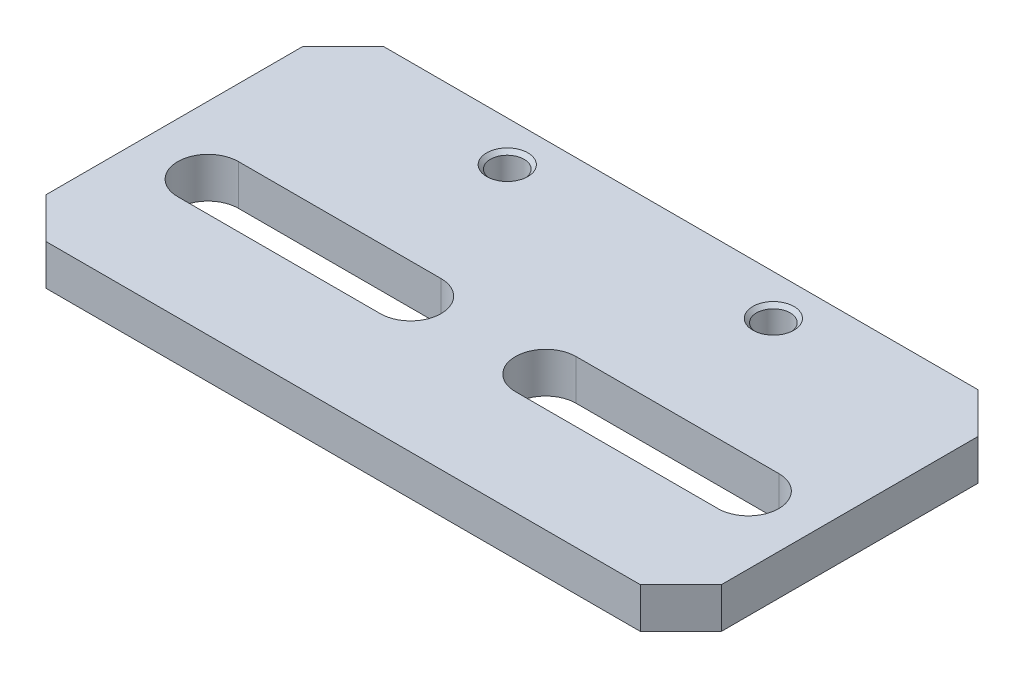
ISO-10303-21;
HEADER;
FILE_DESCRIPTION(('STEP AP214'),'2;1');
FILE_NAME('part.step','',(''),(''),'','','');
FILE_SCHEMA(('AUTOMOTIVE_DESIGN { 1 0 10303 214 1 1 1 1 }'));
ENDSEC;
DATA;
#1=APPLICATION_CONTEXT('core data for automotive mechanical design processes');
#2=APPLICATION_PROTOCOL_DEFINITION('international standard','automotive_design',2000,#1);
#3=PRODUCT_CONTEXT('',#1,'mechanical');
#4=PRODUCT('Part','Part','',(#3));
#5=PRODUCT_RELATED_PRODUCT_CATEGORY('part','',(#4));
#6=PRODUCT_DEFINITION_FORMATION('','',#4);
#7=PRODUCT_DEFINITION_CONTEXT('part definition',#1,'design');
#8=PRODUCT_DEFINITION('design','',#6,#7);
#9=PRODUCT_DEFINITION_SHAPE('','',#8);
#10=(LENGTH_UNIT() NAMED_UNIT(*) SI_UNIT(.MILLI.,.METRE.));
#11=(NAMED_UNIT(*) PLANE_ANGLE_UNIT() SI_UNIT($,.RADIAN.));
#12=(NAMED_UNIT(*) SI_UNIT($,.STERADIAN.) SOLID_ANGLE_UNIT());
#13=UNCERTAINTY_MEASURE_WITH_UNIT(LENGTH_MEASURE(1.E-05),#10,'distance_accuracy_value','');
#14=(GEOMETRIC_REPRESENTATION_CONTEXT(3) GLOBAL_UNCERTAINTY_ASSIGNED_CONTEXT((#13)) GLOBAL_UNIT_ASSIGNED_CONTEXT((#10,
#11,#12)) REPRESENTATION_CONTEXT('',''));
#15=CARTESIAN_POINT('',(0.,0.,0.));
#16=DIRECTION('',(0.,0.,1.));
#17=DIRECTION('',(1.,0.,0.));
#18=AXIS2_PLACEMENT_3D('',#15,#16,#17);
#19=CARTESIAN_POINT('',(22.,3.,-12.5));
#20=DIRECTION('',(-0.707106781186548,0.,0.707106781186547));
#21=DIRECTION('',(0.,1.,0.));
#22=AXIS2_PLACEMENT_3D('',#19,#20,#21);
#23=PLANE('',#22);
#24=DIRECTION('',(-0.707106781186547,0.,-0.707106781186548));
#25=VECTOR('',#24,1.);
#26=CARTESIAN_POINT('',(17.25,3.,-17.25));
#27=LINE('',#26,#25);
#28=CARTESIAN_POINT('',(25.,3.,-9.5));
#29=VERTEX_POINT('',#28);
#30=CARTESIAN_POINT('',(22.,3.,-12.5));
#31=VERTEX_POINT('',#30);
#32=EDGE_CURVE('E200',#29,#31,#27,.T.);
#33=ORIENTED_EDGE('',*,*,#32,.F.);
#34=DIRECTION('',(0.,1.,0.));
#35=VECTOR('',#34,1.);
#36=CARTESIAN_POINT('',(25.,3.,-9.5));
#37=LINE('',#36,#35);
#38=CARTESIAN_POINT('',(25.,0.,-9.5));
#39=VERTEX_POINT('',#38);
#40=EDGE_CURVE('E202',#39,#29,#37,.T.);
#41=ORIENTED_EDGE('',*,*,#40,.F.);
#42=DIRECTION('',(0.707106781186547,0.,0.707106781186548));
#43=VECTOR('',#42,1.);
#44=CARTESIAN_POINT('',(22.,0.,-12.5));
#45=LINE('',#44,#43);
#46=CARTESIAN_POINT('',(22.,0.,-12.5));
#47=VERTEX_POINT('',#46);
#48=EDGE_CURVE('E242',#47,#39,#45,.T.);
#49=ORIENTED_EDGE('',*,*,#48,.F.);
#50=DIRECTION('',(0.,-1.,0.));
#51=VECTOR('',#50,1.);
#52=CARTESIAN_POINT('',(22.,3.,-12.5));
#53=LINE('',#52,#51);
#54=EDGE_CURVE('E205',#31,#47,#53,.T.);
#55=ORIENTED_EDGE('',*,*,#54,.F.);
#56=EDGE_LOOP('',(#33,#41,#49,#55));
#57=FACE_BOUND('',#56,.T.);
#58=ADVANCED_FACE('F17',(#57),#23,.F.);
#59=CARTESIAN_POINT('',(-25.,3.,-9.5));
#60=DIRECTION('',(0.707106781186547,0.,0.707106781186548));
#61=DIRECTION('',(0.,-1.,0.));
#62=AXIS2_PLACEMENT_3D('',#59,#60,#61);
#63=PLANE('',#62);
#64=DIRECTION('',(-0.707106781186548,0.,0.707106781186547));
#65=VECTOR('',#64,1.);
#66=CARTESIAN_POINT('',(-17.25,3.,-17.25));
#67=LINE('',#66,#65);
#68=CARTESIAN_POINT('',(-22.,3.,-12.5));
#69=VERTEX_POINT('',#68);
#70=CARTESIAN_POINT('',(-25.,3.,-9.5));
#71=VERTEX_POINT('',#70);
#72=EDGE_CURVE('E211',#69,#71,#67,.T.);
#73=ORIENTED_EDGE('',*,*,#72,.F.);
#74=DIRECTION('',(0.,1.,0.));
#75=VECTOR('',#74,1.);
#76=CARTESIAN_POINT('',(-22.,3.,-12.5));
#77=LINE('',#76,#75);
#78=CARTESIAN_POINT('',(-22.,0.,-12.5));
#79=VERTEX_POINT('',#78);
#80=EDGE_CURVE('E256',#79,#69,#77,.T.);
#81=ORIENTED_EDGE('',*,*,#80,.F.);
#82=DIRECTION('',(0.707106781186548,0.,-0.707106781186547));
#83=VECTOR('',#82,1.);
#84=CARTESIAN_POINT('',(-25.,0.,-9.5));
#85=LINE('',#84,#83);
#86=CARTESIAN_POINT('',(-25.,0.,-9.5));
#87=VERTEX_POINT('',#86);
#88=EDGE_CURVE('E246',#87,#79,#85,.T.);
#89=ORIENTED_EDGE('',*,*,#88,.F.);
#90=DIRECTION('',(0.,-1.,0.));
#91=VECTOR('',#90,1.);
#92=CARTESIAN_POINT('',(-25.,3.,-9.5));
#93=LINE('',#92,#91);
#94=EDGE_CURVE('E406',#71,#87,#93,.T.);
#95=ORIENTED_EDGE('',*,*,#94,.F.);
#96=EDGE_LOOP('',(#73,#81,#89,#95));
#97=FACE_BOUND('',#96,.T.);
#98=ADVANCED_FACE('F795',(#97),#63,.F.);
#99=CARTESIAN_POINT('',(-22.,3.,12.5));
#100=DIRECTION('',(0.707106781186548,0.,-0.707106781186547));
#101=DIRECTION('',(0.,-1.,0.));
#102=AXIS2_PLACEMENT_3D('',#99,#100,#101);
#103=PLANE('',#102);
#104=DIRECTION('',(0.707106781186547,0.,0.707106781186548));
#105=VECTOR('',#104,1.);
#106=CARTESIAN_POINT('',(-17.25,3.,17.25));
#107=LINE('',#106,#105);
#108=CARTESIAN_POINT('',(-25.,3.,9.5));
#109=VERTEX_POINT('',#108);
#110=CARTESIAN_POINT('',(-22.,3.,12.5));
#111=VERTEX_POINT('',#110);
#112=EDGE_CURVE('E268',#109,#111,#107,.T.);
#113=ORIENTED_EDGE('',*,*,#112,.F.);
#114=DIRECTION('',(0.,1.,0.));
#115=VECTOR('',#114,1.);
#116=CARTESIAN_POINT('',(-25.,3.,9.5));
#117=LINE('',#116,#115);
#118=CARTESIAN_POINT('',(-25.,0.,9.5));
#119=VERTEX_POINT('',#118);
#120=EDGE_CURVE('E433',#119,#109,#117,.T.);
#121=ORIENTED_EDGE('',*,*,#120,.F.);
#122=DIRECTION('',(-0.707106781186547,0.,-0.707106781186548));
#123=VECTOR('',#122,1.);
#124=CARTESIAN_POINT('',(-22.,0.,12.5));
#125=LINE('',#124,#123);
#126=CARTESIAN_POINT('',(-22.,0.,12.5));
#127=VERTEX_POINT('',#126);
#128=EDGE_CURVE('E257',#127,#119,#125,.T.);
#129=ORIENTED_EDGE('',*,*,#128,.F.);
#130=DIRECTION('',(0.,-1.,0.));
#131=VECTOR('',#130,1.);
#132=CARTESIAN_POINT('',(-22.,3.,12.5));
#133=LINE('',#132,#131);
#134=EDGE_CURVE('E229',#111,#127,#133,.T.);
#135=ORIENTED_EDGE('',*,*,#134,.F.);
#136=EDGE_LOOP('',(#113,#121,#129,#135));
#137=FACE_BOUND('',#136,.T.);
#138=ADVANCED_FACE('F432',(#137),#103,.F.);
#139=CARTESIAN_POINT('',(25.,3.,9.5));
#140=DIRECTION('',(-0.707106781186547,0.,-0.707106781186548));
#141=DIRECTION('',(-0.707106781186548,0.,0.707106781186547));
#142=AXIS2_PLACEMENT_3D('',#139,#140,#141);
#143=PLANE('',#142);
#144=DIRECTION('',(0.707106781186548,0.,-0.707106781186547));
#145=VECTOR('',#144,1.);
#146=CARTESIAN_POINT('',(17.25,3.,17.25));
#147=LINE('',#146,#145);
#148=CARTESIAN_POINT('',(22.,3.,12.5));
#149=VERTEX_POINT('',#148);
#150=CARTESIAN_POINT('',(25.,3.,9.5));
#151=VERTEX_POINT('',#150);
#152=EDGE_CURVE('E212',#149,#151,#147,.T.);
#153=ORIENTED_EDGE('',*,*,#152,.F.);
#154=DIRECTION('',(0.,1.,0.));
#155=VECTOR('',#154,1.);
#156=CARTESIAN_POINT('',(22.,3.,12.5));
#157=LINE('',#156,#155);
#158=CARTESIAN_POINT('',(22.,0.,12.5));
#159=VERTEX_POINT('',#158);
#160=EDGE_CURVE('E396',#159,#149,#157,.T.);
#161=ORIENTED_EDGE('',*,*,#160,.F.);
#162=DIRECTION('',(-0.707106781186548,0.,0.707106781186547));
#163=VECTOR('',#162,1.);
#164=CARTESIAN_POINT('',(25.,0.,9.5));
#165=LINE('',#164,#163);
#166=CARTESIAN_POINT('',(25.,0.,9.5));
#167=VERTEX_POINT('',#166);
#168=EDGE_CURVE('E259',#167,#159,#165,.T.);
#169=ORIENTED_EDGE('',*,*,#168,.F.);
#170=DIRECTION('',(0.,-1.,0.));
#171=VECTOR('',#170,1.);
#172=CARTESIAN_POINT('',(25.,3.,9.5));
#173=LINE('',#172,#171);
#174=EDGE_CURVE('E228',#151,#167,#173,.T.);
#175=ORIENTED_EDGE('',*,*,#174,.F.);
#176=EDGE_LOOP('',(#153,#161,#169,#175));
#177=FACE_BOUND('',#176,.T.);
#178=ADVANCED_FACE('F394',(#177),#143,.F.);
#179=CARTESIAN_POINT('',(-20.,0.,4.75));
#180=DIRECTION('',(0.,0.,1.));
#181=DIRECTION('',(1.,0.,0.));
#182=AXIS2_PLACEMENT_3D('',#179,#180,#181);
#183=PLANE('',#182);
#184=DIRECTION('',(1.,0.,0.));
#185=VECTOR('',#184,1.);
#186=CARTESIAN_POINT('',(-20.,3.,4.75));
#187=LINE('',#186,#185);
#188=CARTESIAN_POINT('',(-20.,3.,4.75));
#189=VERTEX_POINT('',#188);
#190=CARTESIAN_POINT('',(-5.,3.,4.75));
#191=VERTEX_POINT('',#190);
#192=EDGE_CURVE('E247',#189,#191,#187,.T.);
#193=ORIENTED_EDGE('',*,*,#192,.T.);
#194=DIRECTION('',(0.,1.,0.));
#195=VECTOR('',#194,1.);
#196=CARTESIAN_POINT('',(-5.,0.,4.75));
#197=LINE('',#196,#195);
#198=CARTESIAN_POINT('',(-5.,0.,4.75));
#199=VERTEX_POINT('',#198);
#200=EDGE_CURVE('E11',#199,#191,#197,.T.);
#201=ORIENTED_EDGE('',*,*,#200,.F.);
#202=DIRECTION('',(1.,0.,0.));
#203=VECTOR('',#202,1.);
#204=CARTESIAN_POINT('',(-20.,0.,4.75));
#205=LINE('',#204,#203);
#206=CARTESIAN_POINT('',(-20.,0.,4.75));
#207=VERTEX_POINT('',#206);
#208=EDGE_CURVE('E321',#207,#199,#205,.T.);
#209=ORIENTED_EDGE('',*,*,#208,.F.);
#210=DIRECTION('',(0.,1.,0.));
#211=VECTOR('',#210,1.);
#212=CARTESIAN_POINT('',(-20.,0.,4.75));
#213=LINE('',#212,#211);
#214=EDGE_CURVE('E355',#207,#189,#213,.T.);
#215=ORIENTED_EDGE('',*,*,#214,.T.);
#216=EDGE_LOOP('',(#193,#201,#209,#215));
#217=FACE_BOUND('',#216,.T.);
#218=ADVANCED_FACE('F380',(#217),#183,.F.);
#219=CARTESIAN_POINT('',(-5.,0.,2.5));
#220=DIRECTION('',(0.,1.,0.));
#221=DIRECTION('',(0.,0.,1.));
#222=AXIS2_PLACEMENT_3D('',#219,#220,#221);
#223=CYLINDRICAL_SURFACE('',#222,2.25);
#224=CARTESIAN_POINT('',(-5.,3.,2.5));
#225=DIRECTION('',(0.,1.,0.));
#226=DIRECTION('',(0.,0.,1.));
#227=AXIS2_PLACEMENT_3D('',#224,#225,#226);
#228=CIRCLE('',#227,2.25);
#229=CARTESIAN_POINT('',(-5.,3.,0.25));
#230=VERTEX_POINT('',#229);
#231=EDGE_CURVE('E252',#191,#230,#228,.T.);
#232=ORIENTED_EDGE('',*,*,#231,.T.);
#233=DIRECTION('',(0.,1.,0.));
#234=VECTOR('',#233,1.);
#235=CARTESIAN_POINT('',(-5.,0.,0.25));
#236=LINE('',#235,#234);
#237=CARTESIAN_POINT('',(-5.,0.,0.25));
#238=VERTEX_POINT('',#237);
#239=EDGE_CURVE('E25',#238,#230,#236,.T.);
#240=ORIENTED_EDGE('',*,*,#239,.F.);
#241=CARTESIAN_POINT('',(-5.,0.,2.5));
#242=DIRECTION('',(0.,1.,0.));
#243=DIRECTION('',(0.,0.,1.));
#244=AXIS2_PLACEMENT_3D('',#241,#242,#243);
#245=CIRCLE('',#244,2.25);
#246=EDGE_CURVE('E325',#199,#238,#245,.T.);
#247=ORIENTED_EDGE('',*,*,#246,.F.);
#248=ORIENTED_EDGE('',*,*,#200,.T.);
#249=EDGE_LOOP('',(#232,#240,#247,#248));
#250=FACE_BOUND('',#249,.T.);
#251=ADVANCED_FACE('F374',(#250),#223,.F.);
#252=CARTESIAN_POINT('',(-20.,0.,0.250000000000007));
#253=DIRECTION('',(0.,0.,-1.));
#254=DIRECTION('',(-1.,0.,0.));
#255=AXIS2_PLACEMENT_3D('',#252,#253,#254);
#256=PLANE('',#255);
#257=DIRECTION('',(-1.,0.,0.));
#258=VECTOR('',#257,1.);
#259=CARTESIAN_POINT('',(-20.,3.,0.250000000000007));
#260=LINE('',#259,#258);
#261=CARTESIAN_POINT('',(-20.,3.,0.250000000000007));
#262=VERTEX_POINT('',#261);
#263=EDGE_CURVE('E278',#230,#262,#260,.T.);
#264=ORIENTED_EDGE('',*,*,#263,.T.);
#265=DIRECTION('',(0.,1.,0.));
#266=VECTOR('',#265,1.);
#267=CARTESIAN_POINT('',(-20.,0.,0.250000000000007));
#268=LINE('',#267,#266);
#269=CARTESIAN_POINT('',(-20.,0.,0.250000000000007));
#270=VERTEX_POINT('',#269);
#271=EDGE_CURVE('E357',#270,#262,#268,.T.);
#272=ORIENTED_EDGE('',*,*,#271,.F.);
#273=DIRECTION('',(-1.,0.,0.));
#274=VECTOR('',#273,1.);
#275=CARTESIAN_POINT('',(-20.,0.,0.250000000000007));
#276=LINE('',#275,#274);
#277=EDGE_CURVE('E245',#238,#270,#276,.T.);
#278=ORIENTED_EDGE('',*,*,#277,.F.);
#279=ORIENTED_EDGE('',*,*,#239,.T.);
#280=EDGE_LOOP('',(#264,#272,#278,#279));
#281=FACE_BOUND('',#280,.T.);
#282=ADVANCED_FACE('F368',(#281),#256,.F.);
#283=CARTESIAN_POINT('',(-20.,0.,2.5));
#284=DIRECTION('',(0.,1.,0.));
#285=DIRECTION('',(0.,0.,1.));
#286=AXIS2_PLACEMENT_3D('',#283,#284,#285);
#287=CYLINDRICAL_SURFACE('',#286,2.25);
#288=CARTESIAN_POINT('',(-20.,3.,2.5));
#289=DIRECTION('',(0.,1.,0.));
#290=DIRECTION('',(0.,0.,1.));
#291=AXIS2_PLACEMENT_3D('',#288,#289,#290);
#292=CIRCLE('',#291,2.25);
#293=EDGE_CURVE('E271',#262,#189,#292,.T.);
#294=ORIENTED_EDGE('',*,*,#293,.T.);
#295=ORIENTED_EDGE('',*,*,#214,.F.);
#296=CARTESIAN_POINT('',(-20.,0.,2.5));
#297=DIRECTION('',(0.,1.,0.));
#298=DIRECTION('',(0.,0.,1.));
#299=AXIS2_PLACEMENT_3D('',#296,#297,#298);
#300=CIRCLE('',#299,2.25);
#301=EDGE_CURVE('E317',#270,#207,#300,.T.);
#302=ORIENTED_EDGE('',*,*,#301,.F.);
#303=ORIENTED_EDGE('',*,*,#271,.T.);
#304=EDGE_LOOP('',(#294,#295,#302,#303));
#305=FACE_BOUND('',#304,.T.);
#306=ADVANCED_FACE('F377',(#305),#287,.F.);
#307=CARTESIAN_POINT('',(20.,0.,0.249999999999994));
#308=DIRECTION('',(0.,0.,-1.));
#309=DIRECTION('',(-1.,0.,0.));
#310=AXIS2_PLACEMENT_3D('',#307,#308,#309);
#311=PLANE('',#310);
#312=DIRECTION('',(-1.,0.,0.));
#313=VECTOR('',#312,1.);
#314=CARTESIAN_POINT('',(20.,3.,0.249999999999994));
#315=LINE('',#314,#313);
#316=CARTESIAN_POINT('',(20.,3.,0.249999999999994));
#317=VERTEX_POINT('',#316);
#318=CARTESIAN_POINT('',(5.,3.,0.25));
#319=VERTEX_POINT('',#318);
#320=EDGE_CURVE('E286',#317,#319,#315,.T.);
#321=ORIENTED_EDGE('',*,*,#320,.T.);
#322=DIRECTION('',(0.,1.,0.));
#323=VECTOR('',#322,1.);
#324=CARTESIAN_POINT('',(5.,0.,0.25));
#325=LINE('',#324,#323);
#326=CARTESIAN_POINT('',(5.,0.,0.25));
#327=VERTEX_POINT('',#326);
#328=EDGE_CURVE('E264',#327,#319,#325,.T.);
#329=ORIENTED_EDGE('',*,*,#328,.F.);
#330=DIRECTION('',(-1.,0.,0.));
#331=VECTOR('',#330,1.);
#332=CARTESIAN_POINT('',(20.,0.,0.249999999999994));
#333=LINE('',#332,#331);
#334=CARTESIAN_POINT('',(20.,0.,0.249999999999994));
#335=VERTEX_POINT('',#334);
#336=EDGE_CURVE('E312',#335,#327,#333,.T.);
#337=ORIENTED_EDGE('',*,*,#336,.F.);
#338=DIRECTION('',(0.,1.,0.));
#339=VECTOR('',#338,1.);
#340=CARTESIAN_POINT('',(20.,0.,0.249999999999994));
#341=LINE('',#340,#339);
#342=EDGE_CURVE('E274',#335,#317,#341,.T.);
#343=ORIENTED_EDGE('',*,*,#342,.T.);
#344=EDGE_LOOP('',(#321,#329,#337,#343));
#345=FACE_BOUND('',#344,.T.);
#346=ADVANCED_FACE('F704',(#345),#311,.F.);
#347=CARTESIAN_POINT('',(5.,0.,2.5));
#348=DIRECTION('',(0.,1.,0.));
#349=DIRECTION('',(0.,0.,1.));
#350=AXIS2_PLACEMENT_3D('',#347,#348,#349);
#351=CYLINDRICAL_SURFACE('',#350,2.25);
#352=CARTESIAN_POINT('',(5.,3.,2.5));
#353=DIRECTION('',(0.,1.,0.));
#354=DIRECTION('',(0.,0.,1.));
#355=AXIS2_PLACEMENT_3D('',#352,#353,#354);
#356=CIRCLE('',#355,2.25);
#357=CARTESIAN_POINT('',(5.,3.,4.75));
#358=VERTEX_POINT('',#357);
#359=EDGE_CURVE('E290',#319,#358,#356,.T.);
#360=ORIENTED_EDGE('',*,*,#359,.T.);
#361=DIRECTION('',(0.,1.,0.));
#362=VECTOR('',#361,1.);
#363=CARTESIAN_POINT('',(5.,0.,4.75));
#364=LINE('',#363,#362);
#365=CARTESIAN_POINT('',(5.,0.,4.75));
#366=VERTEX_POINT('',#365);
#367=EDGE_CURVE('E261',#366,#358,#364,.T.);
#368=ORIENTED_EDGE('',*,*,#367,.F.);
#369=CARTESIAN_POINT('',(5.,0.,2.5));
#370=DIRECTION('',(0.,1.,0.));
#371=DIRECTION('',(0.,0.,1.));
#372=AXIS2_PLACEMENT_3D('',#369,#370,#371);
#373=CIRCLE('',#372,2.25);
#374=EDGE_CURVE('E335',#327,#366,#373,.T.);
#375=ORIENTED_EDGE('',*,*,#374,.F.);
#376=ORIENTED_EDGE('',*,*,#328,.T.);
#377=EDGE_LOOP('',(#360,#368,#375,#376));
#378=FACE_BOUND('',#377,.T.);
#379=ADVANCED_FACE('F699',(#378),#351,.F.);
#380=CARTESIAN_POINT('',(20.,0.,4.75));
#381=DIRECTION('',(0.,0.,1.));
#382=DIRECTION('',(1.,0.,0.));
#383=AXIS2_PLACEMENT_3D('',#380,#381,#382);
#384=PLANE('',#383);
#385=DIRECTION('',(1.,0.,0.));
#386=VECTOR('',#385,1.);
#387=CARTESIAN_POINT('',(20.,3.,4.75));
#388=LINE('',#387,#386);
#389=CARTESIAN_POINT('',(20.,3.,4.75));
#390=VERTEX_POINT('',#389);
#391=EDGE_CURVE('E299',#358,#390,#388,.T.);
#392=ORIENTED_EDGE('',*,*,#391,.T.);
#393=DIRECTION('',(0.,1.,0.));
#394=VECTOR('',#393,1.);
#395=CARTESIAN_POINT('',(20.,0.,4.75));
#396=LINE('',#395,#394);
#397=CARTESIAN_POINT('',(20.,0.,4.75));
#398=VERTEX_POINT('',#397);
#399=EDGE_CURVE('E265',#398,#390,#396,.T.);
#400=ORIENTED_EDGE('',*,*,#399,.F.);
#401=DIRECTION('',(1.,0.,0.));
#402=VECTOR('',#401,1.);
#403=CARTESIAN_POINT('',(20.,0.,4.75));
#404=LINE('',#403,#402);
#405=EDGE_CURVE('E313',#366,#398,#404,.T.);
#406=ORIENTED_EDGE('',*,*,#405,.F.);
#407=ORIENTED_EDGE('',*,*,#367,.T.);
#408=EDGE_LOOP('',(#392,#400,#406,#407));
#409=FACE_BOUND('',#408,.T.);
#410=ADVANCED_FACE('F703',(#409),#384,.F.);
#411=CARTESIAN_POINT('',(20.,0.,2.5));
#412=DIRECTION('',(0.,1.,0.));
#413=DIRECTION('',(0.,0.,1.));
#414=AXIS2_PLACEMENT_3D('',#411,#412,#413);
#415=CYLINDRICAL_SURFACE('',#414,2.25);
#416=CARTESIAN_POINT('',(20.,3.,2.5));
#417=DIRECTION('',(0.,1.,0.));
#418=DIRECTION('',(0.,0.,1.));
#419=AXIS2_PLACEMENT_3D('',#416,#417,#418);
#420=CIRCLE('',#419,2.25);
#421=EDGE_CURVE('E251',#390,#317,#420,.T.);
#422=ORIENTED_EDGE('',*,*,#421,.T.);
#423=ORIENTED_EDGE('',*,*,#342,.F.);
#424=CARTESIAN_POINT('',(20.,0.,2.5));
#425=DIRECTION('',(0.,1.,0.));
#426=DIRECTION('',(0.,0.,1.));
#427=AXIS2_PLACEMENT_3D('',#424,#425,#426);
#428=CIRCLE('',#427,2.25);
#429=EDGE_CURVE('E308',#398,#335,#428,.T.);
#430=ORIENTED_EDGE('',*,*,#429,.F.);
#431=ORIENTED_EDGE('',*,*,#399,.T.);
#432=EDGE_LOOP('',(#422,#423,#430,#431));
#433=FACE_BOUND('',#432,.T.);
#434=ADVANCED_FACE('F786',(#433),#415,.F.);
#435=CARTESIAN_POINT('',(-9.85,3.,-9.5));
#436=DIRECTION('',(0.,1.,0.));
#437=DIRECTION('',(0.,0.,1.));
#438=AXIS2_PLACEMENT_3D('',#435,#436,#437);
#439=CONICAL_SURFACE('',#438,1.525,0.785398163397448);
#440=CARTESIAN_POINT('',(-9.85,2.725,-9.5));
#441=DIRECTION('',(0.,1.,0.));
#442=DIRECTION('',(0.,0.,1.));
#443=AXIS2_PLACEMENT_3D('',#440,#441,#442);
#444=CIRCLE('',#443,1.25);
#445=CARTESIAN_POINT('',(-9.85,2.725,-8.25));
#446=VERTEX_POINT('',#445);
#447=EDGE_CURVE('E36',#446,#446,#444,.T.);
#448=ORIENTED_EDGE('',*,*,#447,.F.);
#449=EDGE_LOOP('',(#448));
#450=FACE_BOUND('',#449,.T.);
#451=CARTESIAN_POINT('',(-9.85,3.,-9.5));
#452=DIRECTION('',(0.,1.,0.));
#453=DIRECTION('',(0.,0.,1.));
#454=AXIS2_PLACEMENT_3D('',#451,#452,#453);
#455=CIRCLE('',#454,1.525);
#456=CARTESIAN_POINT('',(-9.85,3.,-7.975));
#457=VERTEX_POINT('',#456);
#458=EDGE_CURVE('E282',#457,#457,#455,.T.);
#459=ORIENTED_EDGE('',*,*,#458,.T.);
#460=EDGE_LOOP('',(#459));
#461=FACE_BOUND('',#460,.T.);
#462=ADVANCED_FACE('F731',(#450,#461),#439,.F.);
#463=CARTESIAN_POINT('',(-9.85,3.,-9.5));
#464=DIRECTION('',(0.,1.,0.));
#465=DIRECTION('',(0.,0.,1.));
#466=AXIS2_PLACEMENT_3D('',#463,#464,#465);
#467=CYLINDRICAL_SURFACE('',#466,1.25);
#468=CARTESIAN_POINT('',(-9.85,0.275,-9.5));
#469=DIRECTION('',(0.,1.,0.));
#470=DIRECTION('',(0.,0.,1.));
#471=AXIS2_PLACEMENT_3D('',#468,#469,#470);
#472=CIRCLE('',#471,1.25);
#473=CARTESIAN_POINT('',(-9.85,0.275,-8.25));
#474=VERTEX_POINT('',#473);
#475=EDGE_CURVE('E44',#474,#474,#472,.T.);
#476=ORIENTED_EDGE('',*,*,#475,.F.);
#477=EDGE_LOOP('',(#476));
#478=FACE_BOUND('',#477,.T.);
#479=ORIENTED_EDGE('',*,*,#447,.T.);
#480=EDGE_LOOP('',(#479));
#481=FACE_BOUND('',#480,.T.);
#482=ADVANCED_FACE('F726',(#478,#481),#467,.F.);
#483=CARTESIAN_POINT('',(-9.85,0.275,-9.5));
#484=DIRECTION('',(0.,-1.,0.));
#485=DIRECTION('',(0.,0.,-1.));
#486=AXIS2_PLACEMENT_3D('',#483,#484,#485);
#487=CONICAL_SURFACE('',#486,1.25,0.785398163397447);
#488=ORIENTED_EDGE('',*,*,#475,.T.);
#489=EDGE_LOOP('',(#488));
#490=FACE_BOUND('',#489,.T.);
#491=CARTESIAN_POINT('',(-9.85,0.,-9.5));
#492=DIRECTION('',(0.,1.,0.));
#493=DIRECTION('',(0.,0.,1.));
#494=AXIS2_PLACEMENT_3D('',#491,#492,#493);
#495=CIRCLE('',#494,1.525);
#496=CARTESIAN_POINT('',(-9.85,0.,-7.975));
#497=VERTEX_POINT('',#496);
#498=EDGE_CURVE('E339',#497,#497,#495,.T.);
#499=ORIENTED_EDGE('',*,*,#498,.F.);
#500=EDGE_LOOP('',(#499));
#501=FACE_BOUND('',#500,.T.);
#502=ADVANCED_FACE('F730',(#490,#501),#487,.F.);
#503=CARTESIAN_POINT('',(9.85,3.,-9.5));
#504=DIRECTION('',(0.,1.,0.));
#505=DIRECTION('',(0.,0.,1.));
#506=AXIS2_PLACEMENT_3D('',#503,#504,#505);
#507=CONICAL_SURFACE('',#506,1.525,0.785398163397448);
#508=CARTESIAN_POINT('',(9.85,2.725,-9.5));
#509=DIRECTION('',(0.,1.,0.));
#510=DIRECTION('',(0.,0.,1.));
#511=AXIS2_PLACEMENT_3D('',#508,#509,#510);
#512=CIRCLE('',#511,1.25);
#513=CARTESIAN_POINT('',(9.85,2.725,-8.25));
#514=VERTEX_POINT('',#513);
#515=EDGE_CURVE('E346',#514,#514,#512,.T.);
#516=ORIENTED_EDGE('',*,*,#515,.F.);
#517=EDGE_LOOP('',(#516));
#518=FACE_BOUND('',#517,.T.);
#519=CARTESIAN_POINT('',(9.85,3.,-9.5));
#520=DIRECTION('',(0.,1.,0.));
#521=DIRECTION('',(0.,0.,1.));
#522=AXIS2_PLACEMENT_3D('',#519,#520,#521);
#523=CIRCLE('',#522,1.525);
#524=CARTESIAN_POINT('',(9.85,3.,-7.975));
#525=VERTEX_POINT('',#524);
#526=EDGE_CURVE('E279',#525,#525,#523,.T.);
#527=ORIENTED_EDGE('',*,*,#526,.T.);
#528=EDGE_LOOP('',(#527));
#529=FACE_BOUND('',#528,.T.);
#530=ADVANCED_FACE('F762',(#518,#529),#507,.F.);
#531=CARTESIAN_POINT('',(9.85,3.,-9.5));
#532=DIRECTION('',(0.,1.,0.));
#533=DIRECTION('',(0.,0.,1.));
#534=AXIS2_PLACEMENT_3D('',#531,#532,#533);
#535=CYLINDRICAL_SURFACE('',#534,1.25);
#536=CARTESIAN_POINT('',(9.85,0.275,-9.5));
#537=DIRECTION('',(0.,1.,0.));
#538=DIRECTION('',(0.,0.,1.));
#539=AXIS2_PLACEMENT_3D('',#536,#537,#538);
#540=CIRCLE('',#539,1.25);
#541=CARTESIAN_POINT('',(9.85,0.275,-8.25));
#542=VERTEX_POINT('',#541);
#543=EDGE_CURVE('E345',#542,#542,#540,.T.);
#544=ORIENTED_EDGE('',*,*,#543,.F.);
#545=EDGE_LOOP('',(#544));
#546=FACE_BOUND('',#545,.T.);
#547=ORIENTED_EDGE('',*,*,#515,.T.);
#548=EDGE_LOOP('',(#547));
#549=FACE_BOUND('',#548,.T.);
#550=ADVANCED_FACE('F748',(#546,#549),#535,.F.);
#551=CARTESIAN_POINT('',(9.85,0.275,-9.5));
#552=DIRECTION('',(0.,-1.,0.));
#553=DIRECTION('',(0.,0.,-1.));
#554=AXIS2_PLACEMENT_3D('',#551,#552,#553);
#555=CONICAL_SURFACE('',#554,1.25,0.785398163397447);
#556=ORIENTED_EDGE('',*,*,#543,.T.);
#557=EDGE_LOOP('',(#556));
#558=FACE_BOUND('',#557,.T.);
#559=CARTESIAN_POINT('',(9.85,0.,-9.5));
#560=DIRECTION('',(0.,1.,0.));
#561=DIRECTION('',(0.,0.,1.));
#562=AXIS2_PLACEMENT_3D('',#559,#560,#561);
#563=CIRCLE('',#562,1.525);
#564=CARTESIAN_POINT('',(9.85,0.,-7.975));
#565=VERTEX_POINT('',#564);
#566=EDGE_CURVE('E342',#565,#565,#563,.T.);
#567=ORIENTED_EDGE('',*,*,#566,.F.);
#568=EDGE_LOOP('',(#567));
#569=FACE_BOUND('',#568,.T.);
#570=ADVANCED_FACE('F385',(#558,#569),#555,.F.);
#571=CARTESIAN_POINT('',(0.,0.,0.));
#572=DIRECTION('',(0.,1.,0.));
#573=DIRECTION('',(1.,0.,0.));
#574=AXIS2_PLACEMENT_3D('',#571,#572,#573);
#575=PLANE('',#574);
#576=ORIENTED_EDGE('',*,*,#566,.T.);
#577=EDGE_LOOP('',(#576));
#578=FACE_BOUND('',#577,.T.);
#579=ORIENTED_EDGE('',*,*,#498,.T.);
#580=EDGE_LOOP('',(#579));
#581=FACE_BOUND('',#580,.T.);
#582=ORIENTED_EDGE('',*,*,#405,.T.);
#583=ORIENTED_EDGE('',*,*,#429,.T.);
#584=ORIENTED_EDGE('',*,*,#336,.T.);
#585=ORIENTED_EDGE('',*,*,#374,.T.);
#586=EDGE_LOOP('',(#582,#583,#584,#585));
#587=FACE_BOUND('',#586,.T.);
#588=ORIENTED_EDGE('',*,*,#277,.T.);
#589=ORIENTED_EDGE('',*,*,#301,.T.);
#590=ORIENTED_EDGE('',*,*,#208,.T.);
#591=ORIENTED_EDGE('',*,*,#246,.T.);
#592=EDGE_LOOP('',(#588,#589,#590,#591));
#593=FACE_BOUND('',#592,.T.);
#594=DIRECTION('',(0.,0.,-1.));
#595=VECTOR('',#594,1.);
#596=CARTESIAN_POINT('',(25.,0.,12.5));
#597=LINE('',#596,#595);
#598=EDGE_CURVE('E220',#167,#39,#597,.T.);
#599=ORIENTED_EDGE('',*,*,#598,.F.);
#600=ORIENTED_EDGE('',*,*,#168,.T.);
#601=DIRECTION('',(1.,0.,0.));
#602=VECTOR('',#601,1.);
#603=CARTESIAN_POINT('',(25.,0.,12.5));
#604=LINE('',#603,#602);
#605=EDGE_CURVE('E401',#127,#159,#604,.T.);
#606=ORIENTED_EDGE('',*,*,#605,.F.);
#607=ORIENTED_EDGE('',*,*,#128,.T.);
#608=DIRECTION('',(0.,0.,1.));
#609=VECTOR('',#608,1.);
#610=CARTESIAN_POINT('',(-25.,0.,12.5));
#611=LINE('',#610,#609);
#612=EDGE_CURVE('E436',#87,#119,#611,.T.);
#613=ORIENTED_EDGE('',*,*,#612,.F.);
#614=ORIENTED_EDGE('',*,*,#88,.T.);
#615=DIRECTION('',(-1.,0.,0.));
#616=VECTOR('',#615,1.);
#617=CARTESIAN_POINT('',(25.,0.,-12.5));
#618=LINE('',#617,#616);
#619=EDGE_CURVE('E222',#47,#79,#618,.T.);
#620=ORIENTED_EDGE('',*,*,#619,.F.);
#621=ORIENTED_EDGE('',*,*,#48,.T.);
#622=EDGE_LOOP('',(#599,#600,#606,#607,#613,#614,#620,#621));
#623=FACE_BOUND('',#622,.T.);
#624=ADVANCED_FACE('F382',(#578,#581,#587,#593,#623),#575,.F.);
#625=CARTESIAN_POINT('',(0.,3.,0.));
#626=DIRECTION('',(0.,1.,0.));
#627=DIRECTION('',(1.,0.,0.));
#628=AXIS2_PLACEMENT_3D('',#625,#626,#627);
#629=PLANE('',#628);
#630=ORIENTED_EDGE('',*,*,#526,.F.);
#631=EDGE_LOOP('',(#630));
#632=FACE_BOUND('',#631,.T.);
#633=ORIENTED_EDGE('',*,*,#458,.F.);
#634=EDGE_LOOP('',(#633));
#635=FACE_BOUND('',#634,.T.);
#636=ORIENTED_EDGE('',*,*,#421,.F.);
#637=ORIENTED_EDGE('',*,*,#391,.F.);
#638=ORIENTED_EDGE('',*,*,#359,.F.);
#639=ORIENTED_EDGE('',*,*,#320,.F.);
#640=EDGE_LOOP('',(#636,#637,#638,#639));
#641=FACE_BOUND('',#640,.T.);
#642=ORIENTED_EDGE('',*,*,#293,.F.);
#643=ORIENTED_EDGE('',*,*,#263,.F.);
#644=ORIENTED_EDGE('',*,*,#231,.F.);
#645=ORIENTED_EDGE('',*,*,#192,.F.);
#646=EDGE_LOOP('',(#642,#643,#644,#645));
#647=FACE_BOUND('',#646,.T.);
#648=DIRECTION('',(1.,0.,0.));
#649=VECTOR('',#648,1.);
#650=CARTESIAN_POINT('',(25.,3.,12.5));
#651=LINE('',#650,#649);
#652=EDGE_CURVE('E238',#111,#149,#651,.T.);
#653=ORIENTED_EDGE('',*,*,#652,.T.);
#654=ORIENTED_EDGE('',*,*,#152,.T.);
#655=DIRECTION('',(0.,0.,-1.));
#656=VECTOR('',#655,1.);
#657=CARTESIAN_POINT('',(25.,3.,12.5));
#658=LINE('',#657,#656);
#659=EDGE_CURVE('E218',#151,#29,#658,.T.);
#660=ORIENTED_EDGE('',*,*,#659,.T.);
#661=ORIENTED_EDGE('',*,*,#32,.T.);
#662=DIRECTION('',(-1.,0.,0.));
#663=VECTOR('',#662,1.);
#664=CARTESIAN_POINT('',(25.,3.,-12.5));
#665=LINE('',#664,#663);
#666=EDGE_CURVE('E419',#31,#69,#665,.T.);
#667=ORIENTED_EDGE('',*,*,#666,.T.);
#668=ORIENTED_EDGE('',*,*,#72,.T.);
#669=DIRECTION('',(0.,0.,1.));
#670=VECTOR('',#669,1.);
#671=CARTESIAN_POINT('',(-25.,3.,12.5));
#672=LINE('',#671,#670);
#673=EDGE_CURVE('E412',#71,#109,#672,.T.);
#674=ORIENTED_EDGE('',*,*,#673,.T.);
#675=ORIENTED_EDGE('',*,*,#112,.T.);
#676=EDGE_LOOP('',(#653,#654,#660,#661,#667,#668,#674,#675));
#677=FACE_BOUND('',#676,.T.);
#678=ADVANCED_FACE('F225',(#632,#635,#641,#647,#677),#629,.T.);
#679=CARTESIAN_POINT('',(25.,3.,-12.5));
#680=DIRECTION('',(0.,0.,1.));
#681=DIRECTION('',(1.,0.,0.));
#682=AXIS2_PLACEMENT_3D('',#679,#680,#681);
#683=PLANE('',#682);
#684=ORIENTED_EDGE('',*,*,#619,.T.);
#685=ORIENTED_EDGE('',*,*,#80,.T.);
#686=ORIENTED_EDGE('',*,*,#666,.F.);
#687=ORIENTED_EDGE('',*,*,#54,.T.);
#688=EDGE_LOOP('',(#684,#685,#686,#687));
#689=FACE_BOUND('',#688,.T.);
#690=ADVANCED_FACE('F713',(#689),#683,.F.);
#691=CARTESIAN_POINT('',(25.,3.,12.5));
#692=DIRECTION('',(-1.,0.,0.));
#693=DIRECTION('',(0.,0.,1.));
#694=AXIS2_PLACEMENT_3D('',#691,#692,#693);
#695=PLANE('',#694);
#696=ORIENTED_EDGE('',*,*,#659,.F.);
#697=ORIENTED_EDGE('',*,*,#174,.T.);
#698=ORIENTED_EDGE('',*,*,#598,.T.);
#699=ORIENTED_EDGE('',*,*,#40,.T.);
#700=EDGE_LOOP('',(#696,#697,#698,#699));
#701=FACE_BOUND('',#700,.T.);
#702=ADVANCED_FACE('F216',(#701),#695,.F.);
#703=CARTESIAN_POINT('',(25.,3.,12.5));
#704=DIRECTION('',(0.,0.,-1.));
#705=DIRECTION('',(-1.,0.,0.));
#706=AXIS2_PLACEMENT_3D('',#703,#704,#705);
#707=PLANE('',#706);
#708=ORIENTED_EDGE('',*,*,#605,.T.);
#709=ORIENTED_EDGE('',*,*,#160,.T.);
#710=ORIENTED_EDGE('',*,*,#652,.F.);
#711=ORIENTED_EDGE('',*,*,#134,.T.);
#712=EDGE_LOOP('',(#708,#709,#710,#711));
#713=FACE_BOUND('',#712,.T.);
#714=ADVANCED_FACE('F403',(#713),#707,.F.);
#715=CARTESIAN_POINT('',(-25.,3.,12.5));
#716=DIRECTION('',(1.,0.,0.));
#717=DIRECTION('',(0.,1.,0.));
#718=AXIS2_PLACEMENT_3D('',#715,#716,#717);
#719=PLANE('',#718);
#720=ORIENTED_EDGE('',*,*,#612,.T.);
#721=ORIENTED_EDGE('',*,*,#120,.T.);
#722=ORIENTED_EDGE('',*,*,#673,.F.);
#723=ORIENTED_EDGE('',*,*,#94,.T.);
#724=EDGE_LOOP('',(#720,#721,#722,#723));
#725=FACE_BOUND('',#724,.T.);
#726=ADVANCED_FACE('F684',(#725),#719,.F.);
#727=CLOSED_SHELL('',(#58,#98,#138,#178,#218,#251,#282,#306,#346,#379,#410,#434,#462,#482,#502,
#530,#550,#570,#624,#678,#690,#702,#714,#726));
#728=MANIFOLD_SOLID_BREP('B1',#727);
#729=ADVANCED_BREP_SHAPE_REPRESENTATION('',(#18,#728),#14);
#730=SHAPE_DEFINITION_REPRESENTATION(#9,#729);
ENDSEC;
END-ISO-10303-21;
